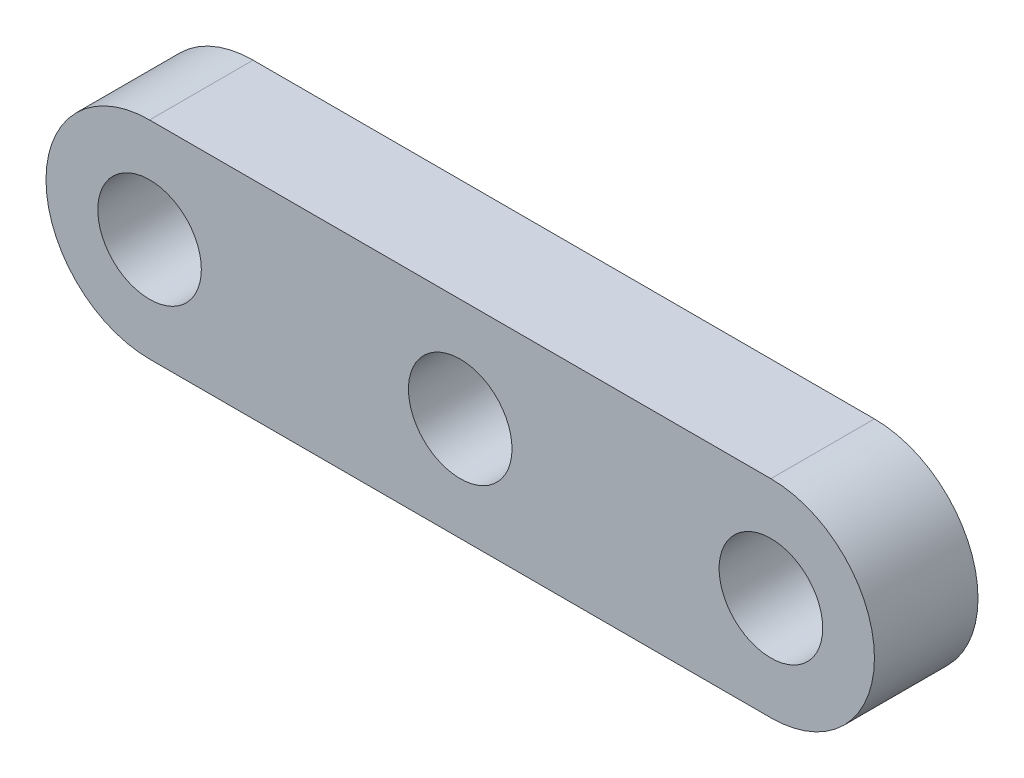
ISO-10303-21;
HEADER;
FILE_DESCRIPTION(('STEP AP214'),'2;1');
FILE_NAME('part.step','',(''),(''),'','','');
FILE_SCHEMA(('AUTOMOTIVE_DESIGN { 1 0 10303 214 1 1 1 1 }'));
ENDSEC;
DATA;
#1=APPLICATION_CONTEXT('core data for automotive mechanical design processes');
#2=APPLICATION_PROTOCOL_DEFINITION('international standard','automotive_design',2000,#1);
#3=PRODUCT_CONTEXT('',#1,'mechanical');
#4=PRODUCT('Part','Part','',(#3));
#5=PRODUCT_RELATED_PRODUCT_CATEGORY('part','',(#4));
#6=PRODUCT_DEFINITION_FORMATION('','',#4);
#7=PRODUCT_DEFINITION_CONTEXT('part definition',#1,'design');
#8=PRODUCT_DEFINITION('design','',#6,#7);
#9=PRODUCT_DEFINITION_SHAPE('','',#8);
#10=(LENGTH_UNIT() NAMED_UNIT(*) SI_UNIT(.MILLI.,.METRE.));
#11=(NAMED_UNIT(*) PLANE_ANGLE_UNIT() SI_UNIT($,.RADIAN.));
#12=(NAMED_UNIT(*) SI_UNIT($,.STERADIAN.) SOLID_ANGLE_UNIT());
#13=UNCERTAINTY_MEASURE_WITH_UNIT(LENGTH_MEASURE(1.E-05),#10,'distance_accuracy_value','');
#14=(GEOMETRIC_REPRESENTATION_CONTEXT(3) GLOBAL_UNCERTAINTY_ASSIGNED_CONTEXT((#13)) GLOBAL_UNIT_ASSIGNED_CONTEXT((#10,
#11,#12)) REPRESENTATION_CONTEXT('',''));
#15=CARTESIAN_POINT('',(0.,0.,0.));
#16=DIRECTION('',(0.,0.,1.));
#17=DIRECTION('',(1.,0.,0.));
#18=AXIS2_PLACEMENT_3D('',#15,#16,#17);
#19=CARTESIAN_POINT('',(19.05,0.,6.35));
#20=DIRECTION('',(0.,0.,-1.));
#21=DIRECTION('',(-1.,0.,0.));
#22=AXIS2_PLACEMENT_3D('',#19,#20,#21);
#23=CYLINDRICAL_SURFACE('',#22,6.35);
#24=CARTESIAN_POINT('',(19.05,0.,0.));
#25=DIRECTION('',(0.,0.,1.));
#26=DIRECTION('',(1.,0.,0.));
#27=AXIS2_PLACEMENT_3D('',#24,#25,#26);
#28=CIRCLE('',#27,6.35);
#29=CARTESIAN_POINT('',(19.05,-6.34999999999999,0.));
#30=VERTEX_POINT('',#29);
#31=CARTESIAN_POINT('',(19.05,6.35000000000001,0.));
#32=VERTEX_POINT('',#31);
#33=EDGE_CURVE('E97',#30,#32,#28,.T.);
#34=ORIENTED_EDGE('',*,*,#33,.T.);
#35=DIRECTION('',(0.,0.,-1.));
#36=VECTOR('',#35,1.);
#37=CARTESIAN_POINT('',(19.05,6.35000000000001,6.35));
#38=LINE('',#37,#36);
#39=CARTESIAN_POINT('',(19.05,6.35000000000001,6.35));
#40=VERTEX_POINT('',#39);
#41=EDGE_CURVE('E11',#40,#32,#38,.T.);
#42=ORIENTED_EDGE('',*,*,#41,.F.);
#43=CARTESIAN_POINT('',(19.05,0.,6.35));
#44=DIRECTION('',(0.,0.,1.));
#45=DIRECTION('',(1.,0.,0.));
#46=AXIS2_PLACEMENT_3D('',#43,#44,#45);
#47=CIRCLE('',#46,6.35);
#48=CARTESIAN_POINT('',(19.05,-6.34999999999999,6.35));
#49=VERTEX_POINT('',#48);
#50=EDGE_CURVE('E85',#49,#40,#47,.T.);
#51=ORIENTED_EDGE('',*,*,#50,.F.);
#52=DIRECTION('',(0.,0.,-1.));
#53=VECTOR('',#52,1.);
#54=CARTESIAN_POINT('',(19.05,-6.34999999999999,6.35));
#55=LINE('',#54,#53);
#56=EDGE_CURVE('E93',#49,#30,#55,.T.);
#57=ORIENTED_EDGE('',*,*,#56,.T.);
#58=EDGE_LOOP('',(#34,#42,#51,#57));
#59=FACE_BOUND('',#58,.T.);
#60=ADVANCED_FACE('F34',(#59),#23,.T.);
#61=CARTESIAN_POINT('',(19.05,6.35000000000001,6.35));
#62=DIRECTION('',(0.,-1.,0.));
#63=DIRECTION('',(1.,0.,0.));
#64=AXIS2_PLACEMENT_3D('',#61,#62,#63);
#65=PLANE('',#64);
#66=DIRECTION('',(-1.,0.,0.));
#67=VECTOR('',#66,1.);
#68=CARTESIAN_POINT('',(19.05,6.35000000000001,0.));
#69=LINE('',#68,#67);
#70=CARTESIAN_POINT('',(-19.05,6.35,0.));
#71=VERTEX_POINT('',#70);
#72=EDGE_CURVE('E89',#32,#71,#69,.T.);
#73=ORIENTED_EDGE('',*,*,#72,.T.);
#74=DIRECTION('',(0.,0.,-1.));
#75=VECTOR('',#74,1.);
#76=CARTESIAN_POINT('',(-19.05,6.35,6.35));
#77=LINE('',#76,#75);
#78=CARTESIAN_POINT('',(-19.05,6.35,6.35));
#79=VERTEX_POINT('',#78);
#80=EDGE_CURVE('E42',#79,#71,#77,.T.);
#81=ORIENTED_EDGE('',*,*,#80,.F.);
#82=DIRECTION('',(-1.,0.,0.));
#83=VECTOR('',#82,1.);
#84=CARTESIAN_POINT('',(19.05,6.35000000000001,6.35));
#85=LINE('',#84,#83);
#86=EDGE_CURVE('E80',#40,#79,#85,.T.);
#87=ORIENTED_EDGE('',*,*,#86,.F.);
#88=ORIENTED_EDGE('',*,*,#41,.T.);
#89=EDGE_LOOP('',(#73,#81,#87,#88));
#90=FACE_BOUND('',#89,.T.);
#91=ADVANCED_FACE('F88',(#90),#65,.F.);
#92=CARTESIAN_POINT('',(-19.05,0.,6.35));
#93=DIRECTION('',(0.,0.,-1.));
#94=DIRECTION('',(-1.,0.,0.));
#95=AXIS2_PLACEMENT_3D('',#92,#93,#94);
#96=CYLINDRICAL_SURFACE('',#95,6.35);
#97=CARTESIAN_POINT('',(-19.05,0.,0.));
#98=DIRECTION('',(0.,0.,1.));
#99=DIRECTION('',(1.,0.,0.));
#100=AXIS2_PLACEMENT_3D('',#97,#98,#99);
#101=CIRCLE('',#100,6.35);
#102=CARTESIAN_POINT('',(-19.05,-6.35,0.));
#103=VERTEX_POINT('',#102);
#104=EDGE_CURVE('E67',#71,#103,#101,.T.);
#105=ORIENTED_EDGE('',*,*,#104,.T.);
#106=DIRECTION('',(0.,0.,-1.));
#107=VECTOR('',#106,1.);
#108=CARTESIAN_POINT('',(-19.05,-6.35,6.35));
#109=LINE('',#108,#107);
#110=CARTESIAN_POINT('',(-19.05,-6.35,6.35));
#111=VERTEX_POINT('',#110);
#112=EDGE_CURVE('E90',#111,#103,#109,.T.);
#113=ORIENTED_EDGE('',*,*,#112,.F.);
#114=CARTESIAN_POINT('',(-19.05,0.,6.35));
#115=DIRECTION('',(0.,0.,1.));
#116=DIRECTION('',(1.,0.,0.));
#117=AXIS2_PLACEMENT_3D('',#114,#115,#116);
#118=CIRCLE('',#117,6.35);
#119=EDGE_CURVE('E83',#79,#111,#118,.T.);
#120=ORIENTED_EDGE('',*,*,#119,.F.);
#121=ORIENTED_EDGE('',*,*,#80,.T.);
#122=EDGE_LOOP('',(#105,#113,#120,#121));
#123=FACE_BOUND('',#122,.T.);
#124=ADVANCED_FACE('F91',(#123),#96,.T.);
#125=CARTESIAN_POINT('',(19.05,-6.34999999999999,6.35));
#126=DIRECTION('',(0.,1.,0.));
#127=DIRECTION('',(-1.,0.,0.));
#128=AXIS2_PLACEMENT_3D('',#125,#126,#127);
#129=PLANE('',#128);
#130=DIRECTION('',(1.,0.,0.));
#131=VECTOR('',#130,1.);
#132=CARTESIAN_POINT('',(19.05,-6.34999999999999,0.));
#133=LINE('',#132,#131);
#134=EDGE_CURVE('E73',#103,#30,#133,.T.);
#135=ORIENTED_EDGE('',*,*,#134,.T.);
#136=ORIENTED_EDGE('',*,*,#56,.F.);
#137=DIRECTION('',(1.,0.,0.));
#138=VECTOR('',#137,1.);
#139=CARTESIAN_POINT('',(19.05,-6.34999999999999,6.35));
#140=LINE('',#139,#138);
#141=EDGE_CURVE('E50',#111,#49,#140,.T.);
#142=ORIENTED_EDGE('',*,*,#141,.F.);
#143=ORIENTED_EDGE('',*,*,#112,.T.);
#144=EDGE_LOOP('',(#135,#136,#142,#143));
#145=FACE_BOUND('',#144,.T.);
#146=ADVANCED_FACE('F105',(#145),#129,.F.);
#147=CARTESIAN_POINT('',(19.05,0.,6.35));
#148=DIRECTION('',(0.,0.,1.));
#149=DIRECTION('',(1.,0.,0.));
#150=AXIS2_PLACEMENT_3D('',#147,#148,#149);
#151=PLANE('',#150);
#152=CARTESIAN_POINT('',(-19.05,0.,6.35));
#153=DIRECTION('',(0.,0.,1.));
#154=DIRECTION('',(1.,0.,0.));
#155=AXIS2_PLACEMENT_3D('',#152,#153,#154);
#156=CIRCLE('',#155,3.175);
#157=CARTESIAN_POINT('',(-15.875,0.,6.35));
#158=VERTEX_POINT('',#157);
#159=EDGE_CURVE('E123',#158,#158,#156,.T.);
#160=ORIENTED_EDGE('',*,*,#159,.F.);
#161=EDGE_LOOP('',(#160));
#162=FACE_BOUND('',#161,.T.);
#163=CARTESIAN_POINT('',(0.,0.,6.35));
#164=DIRECTION('',(0.,0.,1.));
#165=DIRECTION('',(1.,0.,0.));
#166=AXIS2_PLACEMENT_3D('',#163,#164,#165);
#167=CIRCLE('',#166,3.175);
#168=CARTESIAN_POINT('',(3.175,0.,6.35));
#169=VERTEX_POINT('',#168);
#170=EDGE_CURVE('E117',#169,#169,#167,.T.);
#171=ORIENTED_EDGE('',*,*,#170,.F.);
#172=EDGE_LOOP('',(#171));
#173=FACE_BOUND('',#172,.T.);
#174=CARTESIAN_POINT('',(19.05,0.,6.35));
#175=DIRECTION('',(0.,0.,1.));
#176=DIRECTION('',(1.,0.,0.));
#177=AXIS2_PLACEMENT_3D('',#174,#175,#176);
#178=CIRCLE('',#177,3.175);
#179=CARTESIAN_POINT('',(22.225,0.,6.35));
#180=VERTEX_POINT('',#179);
#181=EDGE_CURVE('E111',#180,#180,#178,.T.);
#182=ORIENTED_EDGE('',*,*,#181,.F.);
#183=EDGE_LOOP('',(#182));
#184=FACE_BOUND('',#183,.T.);
#185=ORIENTED_EDGE('',*,*,#50,.T.);
#186=ORIENTED_EDGE('',*,*,#86,.T.);
#187=ORIENTED_EDGE('',*,*,#119,.T.);
#188=ORIENTED_EDGE('',*,*,#141,.T.);
#189=EDGE_LOOP('',(#185,#186,#187,#188));
#190=FACE_BOUND('',#189,.T.);
#191=ADVANCED_FACE('F81',(#162,#173,#184,#190),#151,.T.);
#192=CARTESIAN_POINT('',(19.05,0.,0.));
#193=DIRECTION('',(0.,0.,1.));
#194=DIRECTION('',(1.,0.,0.));
#195=AXIS2_PLACEMENT_3D('',#192,#193,#194);
#196=PLANE('',#195);
#197=CARTESIAN_POINT('',(-19.05,0.,0.));
#198=DIRECTION('',(0.,0.,1.));
#199=DIRECTION('',(1.,0.,0.));
#200=AXIS2_PLACEMENT_3D('',#197,#198,#199);
#201=CIRCLE('',#200,3.175);
#202=CARTESIAN_POINT('',(-15.875,0.,0.));
#203=VERTEX_POINT('',#202);
#204=EDGE_CURVE('E100',#203,#203,#201,.T.);
#205=ORIENTED_EDGE('',*,*,#204,.T.);
#206=EDGE_LOOP('',(#205));
#207=FACE_BOUND('',#206,.T.);
#208=CARTESIAN_POINT('',(0.,0.,0.));
#209=DIRECTION('',(0.,0.,1.));
#210=DIRECTION('',(1.,0.,0.));
#211=AXIS2_PLACEMENT_3D('',#208,#209,#210);
#212=CIRCLE('',#211,3.175);
#213=CARTESIAN_POINT('',(3.175,0.,0.));
#214=VERTEX_POINT('',#213);
#215=EDGE_CURVE('E120',#214,#214,#212,.T.);
#216=ORIENTED_EDGE('',*,*,#215,.T.);
#217=EDGE_LOOP('',(#216));
#218=FACE_BOUND('',#217,.T.);
#219=CARTESIAN_POINT('',(19.05,0.,0.));
#220=DIRECTION('',(0.,0.,1.));
#221=DIRECTION('',(1.,0.,0.));
#222=AXIS2_PLACEMENT_3D('',#219,#220,#221);
#223=CIRCLE('',#222,3.175);
#224=CARTESIAN_POINT('',(22.225,0.,0.));
#225=VERTEX_POINT('',#224);
#226=EDGE_CURVE('E114',#225,#225,#223,.T.);
#227=ORIENTED_EDGE('',*,*,#226,.T.);
#228=EDGE_LOOP('',(#227));
#229=FACE_BOUND('',#228,.T.);
#230=ORIENTED_EDGE('',*,*,#33,.F.);
#231=ORIENTED_EDGE('',*,*,#134,.F.);
#232=ORIENTED_EDGE('',*,*,#104,.F.);
#233=ORIENTED_EDGE('',*,*,#72,.F.);
#234=EDGE_LOOP('',(#230,#231,#232,#233));
#235=FACE_BOUND('',#234,.T.);
#236=ADVANCED_FACE('F108',(#207,#218,#229,#235),#196,.F.);
#237=CARTESIAN_POINT('',(19.05,0.,0.));
#238=DIRECTION('',(0.,0.,1.));
#239=DIRECTION('',(1.,0.,0.));
#240=AXIS2_PLACEMENT_3D('',#237,#238,#239);
#241=CYLINDRICAL_SURFACE('',#240,3.175);
#242=ORIENTED_EDGE('',*,*,#226,.F.);
#243=EDGE_LOOP('',(#242));
#244=FACE_BOUND('',#243,.T.);
#245=ORIENTED_EDGE('',*,*,#181,.T.);
#246=EDGE_LOOP('',(#245));
#247=FACE_BOUND('',#246,.T.);
#248=ADVANCED_FACE('F145',(#244,#247),#241,.F.);
#249=CARTESIAN_POINT('',(0.,0.,0.));
#250=DIRECTION('',(0.,0.,1.));
#251=DIRECTION('',(1.,0.,0.));
#252=AXIS2_PLACEMENT_3D('',#249,#250,#251);
#253=CYLINDRICAL_SURFACE('',#252,3.175);
#254=ORIENTED_EDGE('',*,*,#215,.F.);
#255=EDGE_LOOP('',(#254));
#256=FACE_BOUND('',#255,.T.);
#257=ORIENTED_EDGE('',*,*,#170,.T.);
#258=EDGE_LOOP('',(#257));
#259=FACE_BOUND('',#258,.T.);
#260=ADVANCED_FACE('F134',(#256,#259),#253,.F.);
#261=CARTESIAN_POINT('',(-19.05,0.,0.));
#262=DIRECTION('',(0.,0.,1.));
#263=DIRECTION('',(1.,0.,0.));
#264=AXIS2_PLACEMENT_3D('',#261,#262,#263);
#265=CYLINDRICAL_SURFACE('',#264,3.175);
#266=ORIENTED_EDGE('',*,*,#204,.F.);
#267=EDGE_LOOP('',(#266));
#268=FACE_BOUND('',#267,.T.);
#269=ORIENTED_EDGE('',*,*,#159,.T.);
#270=EDGE_LOOP('',(#269));
#271=FACE_BOUND('',#270,.T.);
#272=ADVANCED_FACE('F131',(#268,#271),#265,.F.);
#273=CLOSED_SHELL('',(#60,#91,#124,#146,#191,#236,#248,#260,#272));
#274=MANIFOLD_SOLID_BREP('B2',#273);
#275=ADVANCED_BREP_SHAPE_REPRESENTATION('',(#18,#274),#14);
#276=SHAPE_DEFINITION_REPRESENTATION(#9,#275);
ENDSEC;
END-ISO-10303-21;
